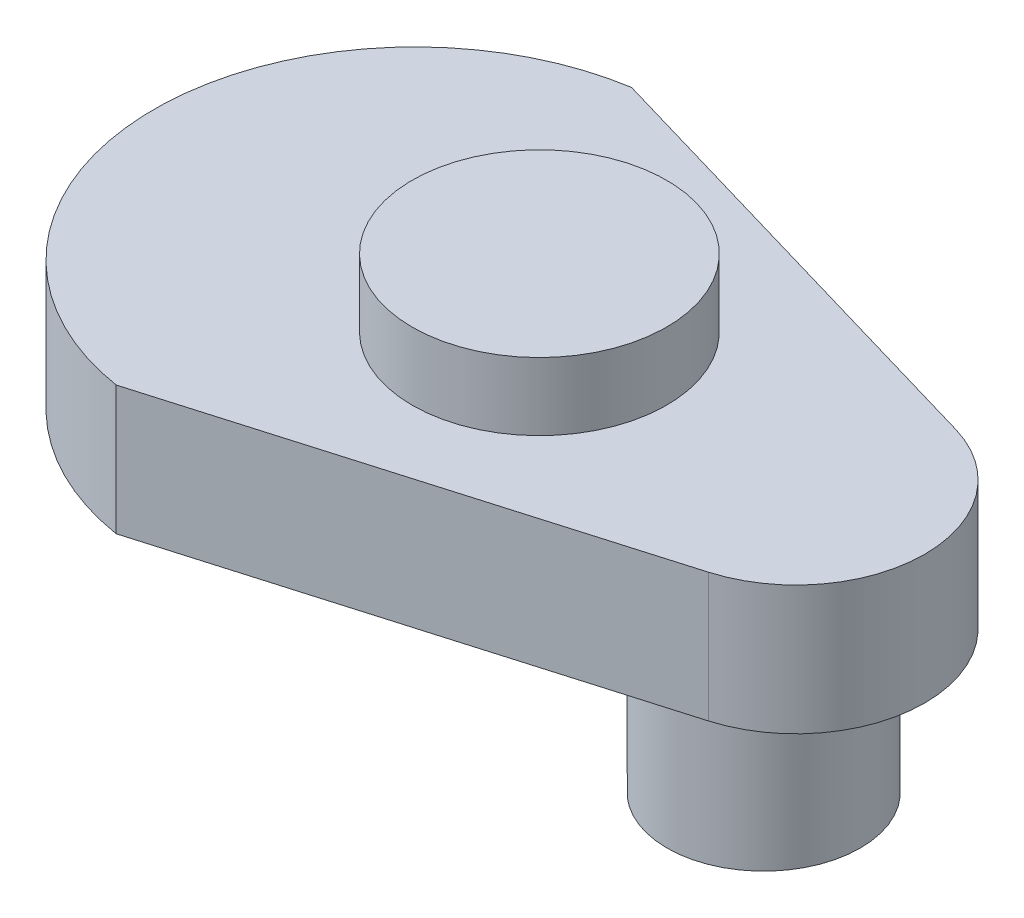
ISO-10303-21;
HEADER;
FILE_DESCRIPTION(('STEP AP214'),'2;1');
FILE_NAME('part.step','',(''),(''),'','','');
FILE_SCHEMA(('AUTOMOTIVE_DESIGN { 1 0 10303 214 1 1 1 1 }'));
ENDSEC;
DATA;
#1=APPLICATION_CONTEXT('core data for automotive mechanical design processes');
#2=APPLICATION_PROTOCOL_DEFINITION('international standard','automotive_design',2000,#1);
#3=PRODUCT_CONTEXT('',#1,'mechanical');
#4=PRODUCT('Part','Part','',(#3));
#5=PRODUCT_RELATED_PRODUCT_CATEGORY('part','',(#4));
#6=PRODUCT_DEFINITION_FORMATION('','',#4);
#7=PRODUCT_DEFINITION_CONTEXT('part definition',#1,'design');
#8=PRODUCT_DEFINITION('design','',#6,#7);
#9=PRODUCT_DEFINITION_SHAPE('','',#8);
#10=(LENGTH_UNIT() NAMED_UNIT(*) SI_UNIT(.MILLI.,.METRE.));
#11=(NAMED_UNIT(*) PLANE_ANGLE_UNIT() SI_UNIT($,.RADIAN.));
#12=(NAMED_UNIT(*) SI_UNIT($,.STERADIAN.) SOLID_ANGLE_UNIT());
#13=UNCERTAINTY_MEASURE_WITH_UNIT(LENGTH_MEASURE(1.E-05),#10,'distance_accuracy_value','');
#14=(GEOMETRIC_REPRESENTATION_CONTEXT(3) GLOBAL_UNCERTAINTY_ASSIGNED_CONTEXT((#13)) GLOBAL_UNIT_ASSIGNED_CONTEXT((#10,
#11,#12)) REPRESENTATION_CONTEXT('',''));
#15=CARTESIAN_POINT('',(0.,0.,0.));
#16=DIRECTION('',(0.,0.,1.));
#17=DIRECTION('',(1.,0.,0.));
#18=AXIS2_PLACEMENT_3D('',#15,#16,#17);
#19=CARTESIAN_POINT('',(47.3139515762505,-12.5,0.));
#20=DIRECTION('',(0.,1.,0.));
#21=DIRECTION('',(0.,0.,1.));
#22=AXIS2_PLACEMENT_3D('',#19,#20,#21);
#23=CYLINDRICAL_SURFACE('',#22,7.5);
#24=CARTESIAN_POINT('',(47.3139515762505,0.,0.));
#25=DIRECTION('',(0.,1.,0.));
#26=DIRECTION('',(0.,0.,1.));
#27=AXIS2_PLACEMENT_3D('',#24,#25,#26);
#28=CIRCLE('',#27,7.5);
#29=CARTESIAN_POINT('',(47.3139515762505,0.,7.5));
#30=VERTEX_POINT('',#29);
#31=EDGE_CURVE('E11',#30,#30,#28,.F.);
#32=ORIENTED_EDGE('',*,*,#31,.T.);
#33=EDGE_LOOP('',(#32));
#34=FACE_BOUND('',#33,.T.);
#35=CARTESIAN_POINT('',(47.3139515762505,-12.25,0.));
#36=DIRECTION('',(0.,-1.,0.));
#37=DIRECTION('',(0.,0.,-1.));
#38=AXIS2_PLACEMENT_3D('',#35,#36,#37);
#39=CIRCLE('',#38,7.5);
#40=CARTESIAN_POINT('',(47.3139515762505,-12.25,-7.5));
#41=VERTEX_POINT('',#40);
#42=EDGE_CURVE('E225',#41,#41,#39,.T.);
#43=ORIENTED_EDGE('',*,*,#42,.F.);
#44=EDGE_LOOP('',(#43));
#45=FACE_BOUND('',#44,.T.);
#46=ADVANCED_FACE('F43',(#34,#45),#23,.T.);
#47=CARTESIAN_POINT('',(6.73471062947671,10.,-23.0215117186819));
#48=DIRECTION('',(0.280772304693179,0.,-0.9597744073048));
#49=DIRECTION('',(-0.9597744073048,0.,-0.280772304693179));
#50=AXIS2_PLACEMENT_3D('',#47,#48,#49);
#51=PLANE('',#50);
#52=DIRECTION('',(0.9597744073048,0.,0.280772304693179));
#53=VECTOR('',#52,1.);
#54=CARTESIAN_POINT('',(6.73471062947671,10.,-23.0215117186819));
#55=LINE('',#54,#53);
#56=CARTESIAN_POINT('',(17.0632564671136,10.,-20.));
#57=VERTEX_POINT('',#56);
#58=CARTESIAN_POINT('',(52.6216746231824,10.,-9.597744073048));
#59=VERTEX_POINT('',#58);
#60=EDGE_CURVE('E89',#57,#59,#55,.T.);
#61=ORIENTED_EDGE('',*,*,#60,.T.);
#62=DIRECTION('',(0.,-1.,0.));
#63=VECTOR('',#62,1.);
#64=CARTESIAN_POINT('',(52.6216746231823,10.,-9.59774407304801));
#65=LINE('',#64,#63);
#66=CARTESIAN_POINT('',(52.6216746231824,0.,-9.597744073048));
#67=VERTEX_POINT('',#66);
#68=EDGE_CURVE('E95',#59,#67,#65,.T.);
#69=ORIENTED_EDGE('',*,*,#68,.T.);
#70=DIRECTION('',(0.9597744073048,0.,0.280772304693179));
#71=VECTOR('',#70,1.);
#72=CARTESIAN_POINT('',(6.73471062947671,0.,-23.0215117186819));
#73=LINE('',#72,#71);
#74=CARTESIAN_POINT('',(17.0632564671136,0.,-20.));
#75=VERTEX_POINT('',#74);
#76=EDGE_CURVE('E91',#75,#67,#73,.T.);
#77=ORIENTED_EDGE('',*,*,#76,.F.);
#78=DIRECTION('',(0.,-1.,0.));
#79=VECTOR('',#78,1.);
#80=CARTESIAN_POINT('',(17.0632564671136,10.,-20.));
#81=LINE('',#80,#79);
#82=EDGE_CURVE('E84',#57,#75,#81,.T.);
#83=ORIENTED_EDGE('',*,*,#82,.F.);
#84=EDGE_LOOP('',(#61,#69,#77,#83));
#85=FACE_BOUND('',#84,.T.);
#86=ADVANCED_FACE('F86',(#85),#51,.T.);
#87=CARTESIAN_POINT('',(20.2527202997438,10.,0.));
#88=DIRECTION('',(0.,-1.,0.));
#89=DIRECTION('',(0.,0.,-1.));
#90=AXIS2_PLACEMENT_3D('',#87,#88,#89);
#91=CYLINDRICAL_SURFACE('',#90,20.2527202997438);
#92=CARTESIAN_POINT('',(20.2527202997438,0.,0.));
#93=DIRECTION('',(0.,1.,0.));
#94=DIRECTION('',(0.,0.,1.));
#95=AXIS2_PLACEMENT_3D('',#92,#93,#94);
#96=CIRCLE('',#95,20.2527202997438);
#97=CARTESIAN_POINT('',(17.0632564671136,0.,20.));
#98=VERTEX_POINT('',#97);
#99=EDGE_CURVE('E111',#75,#98,#96,.T.);
#100=ORIENTED_EDGE('',*,*,#99,.T.);
#101=DIRECTION('',(0.,-1.,0.));
#102=VECTOR('',#101,1.);
#103=CARTESIAN_POINT('',(17.0632564671136,10.,20.));
#104=LINE('',#103,#102);
#105=CARTESIAN_POINT('',(17.0632564671136,10.,20.));
#106=VERTEX_POINT('',#105);
#107=EDGE_CURVE('E96',#106,#98,#104,.T.);
#108=ORIENTED_EDGE('',*,*,#107,.F.);
#109=CARTESIAN_POINT('',(20.2527202997438,10.,0.));
#110=DIRECTION('',(0.,1.,0.));
#111=DIRECTION('',(0.,0.,1.));
#112=AXIS2_PLACEMENT_3D('',#109,#110,#111);
#113=CIRCLE('',#112,20.2527202997438);
#114=EDGE_CURVE('E100',#57,#106,#113,.T.);
#115=ORIENTED_EDGE('',*,*,#114,.F.);
#116=ORIENTED_EDGE('',*,*,#82,.T.);
#117=EDGE_LOOP('',(#100,#108,#115,#116));
#118=FACE_BOUND('',#117,.T.);
#119=ADVANCED_FACE('F101',(#118),#91,.T.);
#120=CARTESIAN_POINT('',(6.73471062947672,10.,23.0215117186819));
#121=DIRECTION('',(0.280772304693179,0.,0.9597744073048));
#122=DIRECTION('',(0.9597744073048,0.,-0.280772304693179));
#123=AXIS2_PLACEMENT_3D('',#120,#121,#122);
#124=PLANE('',#123);
#125=DIRECTION('',(-0.9597744073048,0.,0.280772304693179));
#126=VECTOR('',#125,1.);
#127=CARTESIAN_POINT('',(6.73471062947672,0.,23.0215117186819));
#128=LINE('',#127,#126);
#129=CARTESIAN_POINT('',(52.6216746231823,0.,9.59774407304801));
#130=VERTEX_POINT('',#129);
#131=EDGE_CURVE('E109',#130,#98,#128,.T.);
#132=ORIENTED_EDGE('',*,*,#131,.F.);
#133=DIRECTION('',(0.,-1.,0.));
#134=VECTOR('',#133,1.);
#135=CARTESIAN_POINT('',(52.6216746231823,10.,9.59774407304801));
#136=LINE('',#135,#134);
#137=CARTESIAN_POINT('',(52.6216746231823,10.,9.59774407304801));
#138=VERTEX_POINT('',#137);
#139=EDGE_CURVE('E58',#130,#138,#136,.F.);
#140=ORIENTED_EDGE('',*,*,#139,.T.);
#141=DIRECTION('',(-0.9597744073048,0.,0.280772304693179));
#142=VECTOR('',#141,1.);
#143=CARTESIAN_POINT('',(6.73471062947672,10.,23.0215117186819));
#144=LINE('',#143,#142);
#145=EDGE_CURVE('E104',#138,#106,#144,.T.);
#146=ORIENTED_EDGE('',*,*,#145,.T.);
#147=ORIENTED_EDGE('',*,*,#107,.T.);
#148=EDGE_LOOP('',(#132,#140,#146,#147));
#149=FACE_BOUND('',#148,.T.);
#150=ADVANCED_FACE('F131',(#149),#124,.T.);
#151=CARTESIAN_POINT('',(0.,10.,0.));
#152=DIRECTION('',(0.,1.,0.));
#153=DIRECTION('',(0.,0.,1.));
#154=AXIS2_PLACEMENT_3D('',#151,#152,#153);
#155=PLANE('',#154);
#156=CARTESIAN_POINT('',(29.9069757881253,10.,0.));
#157=DIRECTION('',(0.,1.,0.));
#158=DIRECTION('',(0.,0.,1.));
#159=AXIS2_PLACEMENT_3D('',#156,#157,#158);
#160=CIRCLE('',#159,9.875);
#161=CARTESIAN_POINT('',(29.9069757881253,10.,9.87500000000001));
#162=VERTEX_POINT('',#161);
#163=EDGE_CURVE('E51',#162,#162,#160,.T.);
#164=ORIENTED_EDGE('',*,*,#163,.F.);
#165=EDGE_LOOP('',(#164));
#166=FACE_BOUND('',#165,.T.);
#167=ORIENTED_EDGE('',*,*,#145,.F.);
#168=CARTESIAN_POINT('',(49.8139515762505,10.,0.));
#169=DIRECTION('',(0.,1.,0.));
#170=DIRECTION('',(0.,0.,1.));
#171=AXIS2_PLACEMENT_3D('',#168,#169,#170);
#172=CIRCLE('',#171,10.);
#173=EDGE_CURVE('E108',#138,#59,#172,.T.);
#174=ORIENTED_EDGE('',*,*,#173,.T.);
#175=ORIENTED_EDGE('',*,*,#60,.F.);
#176=ORIENTED_EDGE('',*,*,#114,.T.);
#177=EDGE_LOOP('',(#167,#174,#175,#176));
#178=FACE_BOUND('',#177,.T.);
#179=ADVANCED_FACE('F106',(#166,#178),#155,.T.);
#180=CARTESIAN_POINT('',(0.,0.,0.));
#181=DIRECTION('',(0.,1.,0.));
#182=DIRECTION('',(0.,0.,1.));
#183=AXIS2_PLACEMENT_3D('',#180,#181,#182);
#184=PLANE('',#183);
#185=ORIENTED_EDGE('',*,*,#31,.F.);
#186=EDGE_LOOP('',(#185));
#187=FACE_BOUND('',#186,.T.);
#188=ORIENTED_EDGE('',*,*,#76,.T.);
#189=CARTESIAN_POINT('',(49.8139515762505,0.,0.));
#190=DIRECTION('',(0.,1.,0.));
#191=DIRECTION('',(0.,0.,1.));
#192=AXIS2_PLACEMENT_3D('',#189,#190,#191);
#193=CIRCLE('',#192,10.);
#194=EDGE_CURVE('E66',#67,#130,#193,.F.);
#195=ORIENTED_EDGE('',*,*,#194,.T.);
#196=ORIENTED_EDGE('',*,*,#131,.T.);
#197=ORIENTED_EDGE('',*,*,#99,.F.);
#198=EDGE_LOOP('',(#188,#195,#196,#197));
#199=FACE_BOUND('',#198,.T.);
#200=ADVANCED_FACE('F130',(#187,#199),#184,.F.);
#201=CARTESIAN_POINT('',(49.8139515762505,10.,0.));
#202=DIRECTION('',(0.,-1.,0.));
#203=DIRECTION('',(0.,0.,-1.));
#204=AXIS2_PLACEMENT_3D('',#201,#202,#203);
#205=CYLINDRICAL_SURFACE('',#204,10.);
#206=ORIENTED_EDGE('',*,*,#173,.F.);
#207=ORIENTED_EDGE('',*,*,#139,.F.);
#208=ORIENTED_EDGE('',*,*,#194,.F.);
#209=ORIENTED_EDGE('',*,*,#68,.F.);
#210=EDGE_LOOP('',(#206,#207,#208,#209));
#211=FACE_BOUND('',#210,.T.);
#212=ADVANCED_FACE('F45',(#211),#205,.T.);
#213=CARTESIAN_POINT('',(29.9069757881253,15.,0.));
#214=DIRECTION('',(0.,-1.,0.));
#215=DIRECTION('',(0.,0.,-1.));
#216=AXIS2_PLACEMENT_3D('',#213,#214,#215);
#217=CYLINDRICAL_SURFACE('',#216,9.875);
#218=ORIENTED_EDGE('',*,*,#163,.T.);
#219=EDGE_LOOP('',(#218));
#220=FACE_BOUND('',#219,.T.);
#221=CARTESIAN_POINT('',(29.9069757881253,15.25,0.));
#222=DIRECTION('',(0.,1.,0.));
#223=DIRECTION('',(0.,0.,1.));
#224=AXIS2_PLACEMENT_3D('',#221,#222,#223);
#225=CIRCLE('',#224,9.875);
#226=CARTESIAN_POINT('',(29.9069757881253,15.25,9.87500000000001));
#227=VERTEX_POINT('',#226);
#228=EDGE_CURVE('E118',#227,#227,#225,.T.);
#229=ORIENTED_EDGE('',*,*,#228,.F.);
#230=EDGE_LOOP('',(#229));
#231=FACE_BOUND('',#230,.T.);
#232=ADVANCED_FACE('F126',(#220,#231),#217,.T.);
#233=CARTESIAN_POINT('',(29.9069757881253,15.25,0.));
#234=DIRECTION('',(0.,1.,0.));
#235=DIRECTION('',(0.,0.,1.));
#236=AXIS2_PLACEMENT_3D('',#233,#234,#235);
#237=PLANE('',#236);
#238=ORIENTED_EDGE('',*,*,#228,.T.);
#239=EDGE_LOOP('',(#238));
#240=FACE_BOUND('',#239,.T.);
#241=ADVANCED_FACE('F152',(#240),#237,.T.);
#242=CARTESIAN_POINT('',(47.3139515762505,-12.25,0.));
#243=DIRECTION('',(0.,-1.,0.));
#244=DIRECTION('',(0.,0.,-1.));
#245=AXIS2_PLACEMENT_3D('',#242,#243,#244);
#246=PLANE('',#245);
#247=ORIENTED_EDGE('',*,*,#42,.T.);
#248=EDGE_LOOP('',(#247));
#249=FACE_BOUND('',#248,.T.);
#250=ADVANCED_FACE('F157',(#249),#246,.T.);
#251=CLOSED_SHELL('',(#46,#86,#119,#150,#179,#200,#212,#232,#241,#250));
#252=MANIFOLD_SOLID_BREP('B2',#251);
#253=ADVANCED_BREP_SHAPE_REPRESENTATION('',(#18,#252),#14);
#254=SHAPE_DEFINITION_REPRESENTATION(#9,#253);
ENDSEC;
END-ISO-10303-21;
